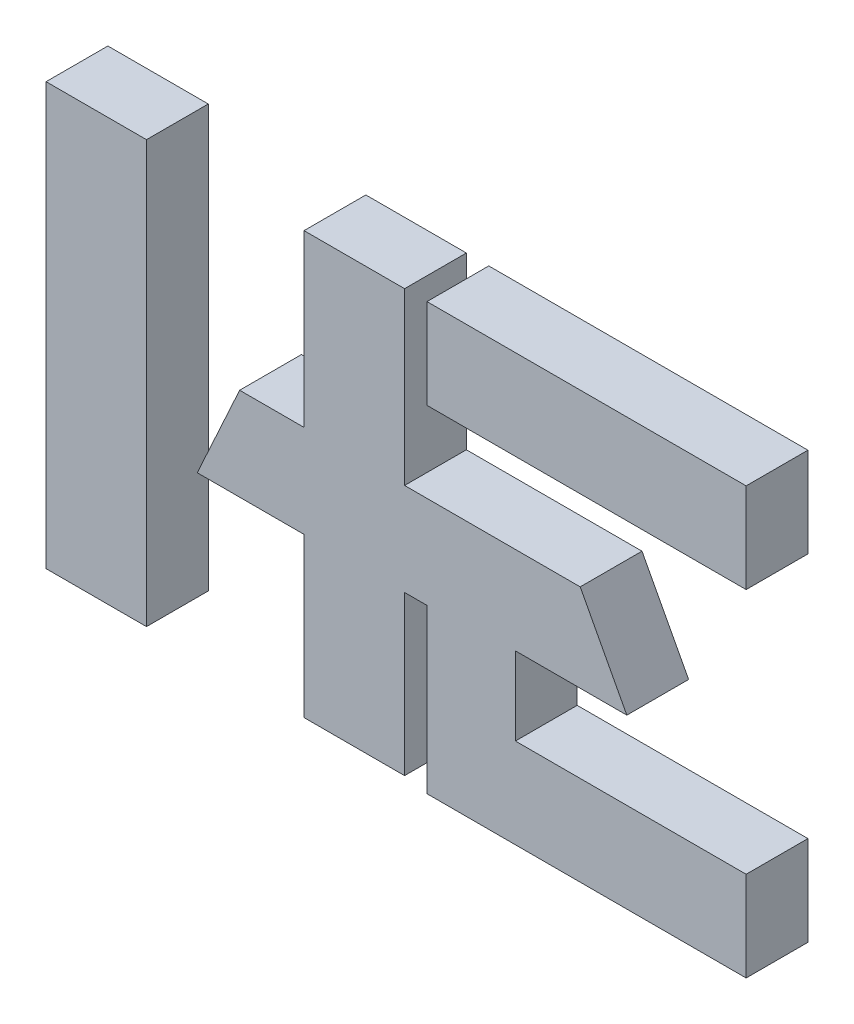
ISO-10303-21;
HEADER;
FILE_DESCRIPTION(('STEP AP214'),'2;1');
FILE_NAME('part.step','',(''),(''),'','','');
FILE_SCHEMA(('AUTOMOTIVE_DESIGN { 1 0 10303 214 1 1 1 1 }'));
ENDSEC;
DATA;
#1=APPLICATION_CONTEXT('core data for automotive mechanical design processes');
#2=APPLICATION_PROTOCOL_DEFINITION('international standard','automotive_design',2000,#1);
#3=PRODUCT_CONTEXT('',#1,'mechanical');
#4=PRODUCT('Part','Part','',(#3));
#5=PRODUCT_RELATED_PRODUCT_CATEGORY('part','',(#4));
#6=PRODUCT_DEFINITION_FORMATION('','',#4);
#7=PRODUCT_DEFINITION_CONTEXT('part definition',#1,'design');
#8=PRODUCT_DEFINITION('design','',#6,#7);
#9=PRODUCT_DEFINITION_SHAPE('','',#8);
#10=(LENGTH_UNIT() NAMED_UNIT(*) SI_UNIT(.MILLI.,.METRE.));
#11=(NAMED_UNIT(*) PLANE_ANGLE_UNIT() SI_UNIT($,.RADIAN.));
#12=(NAMED_UNIT(*) SI_UNIT($,.STERADIAN.) SOLID_ANGLE_UNIT());
#13=UNCERTAINTY_MEASURE_WITH_UNIT(LENGTH_MEASURE(1.E-05),#10,'distance_accuracy_value','');
#14=(GEOMETRIC_REPRESENTATION_CONTEXT(3) GLOBAL_UNCERTAINTY_ASSIGNED_CONTEXT((#13)) GLOBAL_UNIT_ASSIGNED_CONTEXT((#10,
#11,#12)) REPRESENTATION_CONTEXT('',''));
#15=CARTESIAN_POINT('',(0.,0.,0.));
#16=DIRECTION('',(0.,0.,1.));
#17=DIRECTION('',(1.,0.,0.));
#18=AXIS2_PLACEMENT_3D('',#15,#16,#17);
#19=CARTESIAN_POINT('',(11.3288772320232,6.86112874345373,2.6));
#20=DIRECTION('',(-1.,0.,0.));
#21=DIRECTION('',(0.,-1.,0.));
#22=AXIS2_PLACEMENT_3D('',#19,#20,#21);
#23=PLANE('',#22);
#24=DIRECTION('',(0.,1.,0.));
#25=VECTOR('',#24,1.);
#26=CARTESIAN_POINT('',(11.3288772320232,6.86112874345373,2.));
#27=LINE('',#26,#25);
#28=CARTESIAN_POINT('',(11.3288772320232,3.95299492930097,2.));
#29=VERTEX_POINT('',#28);
#30=CARTESIAN_POINT('',(11.3288772320232,6.86112874345373,2.));
#31=VERTEX_POINT('',#30);
#32=EDGE_CURVE('E84',#29,#31,#27,.T.);
#33=ORIENTED_EDGE('',*,*,#32,.F.);
#34=DIRECTION('',(0.,0.,-1.));
#35=VECTOR('',#34,1.);
#36=CARTESIAN_POINT('',(11.3288772320232,3.95299492930097,2.6));
#37=LINE('',#36,#35);
#38=CARTESIAN_POINT('',(11.3288772320232,3.95299492930097,0.));
#39=VERTEX_POINT('',#38);
#40=EDGE_CURVE('E66',#29,#39,#37,.T.);
#41=ORIENTED_EDGE('',*,*,#40,.T.);
#42=DIRECTION('',(0.,1.,0.));
#43=VECTOR('',#42,1.);
#44=CARTESIAN_POINT('',(11.3288772320232,6.86112874345373,0.));
#45=LINE('',#44,#43);
#46=CARTESIAN_POINT('',(11.3288772320232,6.86112874345373,0.));
#47=VERTEX_POINT('',#46);
#48=EDGE_CURVE('E89',#39,#47,#45,.T.);
#49=ORIENTED_EDGE('',*,*,#48,.T.);
#50=DIRECTION('',(0.,0.,-1.));
#51=VECTOR('',#50,1.);
#52=CARTESIAN_POINT('',(11.3288772320232,6.86112874345373,2.6));
#53=LINE('',#52,#51);
#54=EDGE_CURVE('E52',#31,#47,#53,.T.);
#55=ORIENTED_EDGE('',*,*,#54,.F.);
#56=EDGE_LOOP('',(#33,#41,#49,#55));
#57=FACE_BOUND('',#56,.T.);
#58=ADVANCED_FACE('F45',(#57),#23,.F.);
#59=CARTESIAN_POINT('',(11.3288772320232,6.86112874345373,2.6));
#60=DIRECTION('',(0.,-1.,0.));
#61=DIRECTION('',(1.,0.,0.));
#62=AXIS2_PLACEMENT_3D('',#59,#60,#61);
#63=PLANE('',#62);
#64=DIRECTION('',(-1.,0.,0.));
#65=VECTOR('',#64,1.);
#66=CARTESIAN_POINT('',(11.3288772320232,6.86112874345373,2.));
#67=LINE('',#66,#65);
#68=CARTESIAN_POINT('',(0.999606814590283,6.86112874345373,2.));
#69=VERTEX_POINT('',#68);
#70=EDGE_CURVE('E90',#31,#69,#67,.T.);
#71=ORIENTED_EDGE('',*,*,#70,.F.);
#72=ORIENTED_EDGE('',*,*,#54,.T.);
#73=DIRECTION('',(-1.,0.,0.));
#74=VECTOR('',#73,1.);
#75=CARTESIAN_POINT('',(11.3288772320232,6.86112874345373,0.));
#76=LINE('',#75,#74);
#77=CARTESIAN_POINT('',(0.999606814590283,6.86112874345373,0.));
#78=VERTEX_POINT('',#77);
#79=EDGE_CURVE('E109',#47,#78,#76,.T.);
#80=ORIENTED_EDGE('',*,*,#79,.T.);
#81=DIRECTION('',(0.,0.,-1.));
#82=VECTOR('',#81,1.);
#83=CARTESIAN_POINT('',(0.999606814590283,6.86112874345373,2.6));
#84=LINE('',#83,#82);
#85=EDGE_CURVE('E98',#69,#78,#84,.T.);
#86=ORIENTED_EDGE('',*,*,#85,.F.);
#87=EDGE_LOOP('',(#71,#72,#80,#86));
#88=FACE_BOUND('',#87,.T.);
#89=ADVANCED_FACE('F107',(#88),#63,.F.);
#90=CARTESIAN_POINT('',(0.999606814590283,6.86112874345373,2.6));
#91=DIRECTION('',(1.,0.,0.));
#92=DIRECTION('',(0.,1.,0.));
#93=AXIS2_PLACEMENT_3D('',#90,#91,#92);
#94=PLANE('',#93);
#95=DIRECTION('',(0.,-1.,0.));
#96=VECTOR('',#95,1.);
#97=CARTESIAN_POINT('',(0.999606814590283,6.86112874345373,2.));
#98=LINE('',#97,#96);
#99=CARTESIAN_POINT('',(0.999606814590285,3.95299492930097,2.));
#100=VERTEX_POINT('',#99);
#101=EDGE_CURVE('E58',#69,#100,#98,.T.);
#102=ORIENTED_EDGE('',*,*,#101,.F.);
#103=ORIENTED_EDGE('',*,*,#85,.T.);
#104=DIRECTION('',(0.,-1.,0.));
#105=VECTOR('',#104,1.);
#106=CARTESIAN_POINT('',(0.999606814590283,6.86112874345373,0.));
#107=LINE('',#106,#105);
#108=CARTESIAN_POINT('',(0.999606814590285,3.95299492930097,0.));
#109=VERTEX_POINT('',#108);
#110=EDGE_CURVE('E100',#78,#109,#107,.T.);
#111=ORIENTED_EDGE('',*,*,#110,.T.);
#112=DIRECTION('',(0.,0.,-1.));
#113=VECTOR('',#112,1.);
#114=CARTESIAN_POINT('',(0.999606814590285,3.95299492930097,2.6));
#115=LINE('',#114,#113);
#116=EDGE_CURVE('E96',#100,#109,#115,.T.);
#117=ORIENTED_EDGE('',*,*,#116,.F.);
#118=EDGE_LOOP('',(#102,#103,#111,#117));
#119=FACE_BOUND('',#118,.T.);
#120=ADVANCED_FACE('F118',(#119),#94,.F.);
#121=CARTESIAN_POINT('',(11.3288772320232,3.95299492930097,2.6));
#122=DIRECTION('',(0.,1.,0.));
#123=DIRECTION('',(-1.,0.,0.));
#124=AXIS2_PLACEMENT_3D('',#121,#122,#123);
#125=PLANE('',#124);
#126=DIRECTION('',(1.,0.,0.));
#127=VECTOR('',#126,1.);
#128=CARTESIAN_POINT('',(11.3288772320232,3.95299492930097,2.));
#129=LINE('',#128,#127);
#130=EDGE_CURVE('E12',#100,#29,#129,.T.);
#131=ORIENTED_EDGE('',*,*,#130,.F.);
#132=ORIENTED_EDGE('',*,*,#116,.T.);
#133=DIRECTION('',(1.,0.,0.));
#134=VECTOR('',#133,1.);
#135=CARTESIAN_POINT('',(11.3288772320232,3.95299492930097,0.));
#136=LINE('',#135,#134);
#137=EDGE_CURVE('E94',#109,#39,#136,.T.);
#138=ORIENTED_EDGE('',*,*,#137,.T.);
#139=ORIENTED_EDGE('',*,*,#40,.F.);
#140=EDGE_LOOP('',(#131,#132,#138,#139));
#141=FACE_BOUND('',#140,.T.);
#142=ADVANCED_FACE('F92',(#141),#125,.F.);
#143=CARTESIAN_POINT('',(0.,0.,0.));
#144=DIRECTION('',(0.,0.,-1.));
#145=DIRECTION('',(-1.,0.,0.));
#146=AXIS2_PLACEMENT_3D('',#143,#144,#145);
#147=PLANE('',#146);
#148=ORIENTED_EDGE('',*,*,#48,.F.);
#149=ORIENTED_EDGE('',*,*,#137,.F.);
#150=ORIENTED_EDGE('',*,*,#110,.F.);
#151=ORIENTED_EDGE('',*,*,#79,.F.);
#152=EDGE_LOOP('',(#148,#149,#150,#151));
#153=FACE_BOUND('',#152,.T.);
#154=ADVANCED_FACE('F112',(#153),#147,.T.);
#155=CARTESIAN_POINT('',(0.,0.,2.));
#156=DIRECTION('',(0.,0.,1.));
#157=DIRECTION('',(1.,0.,0.));
#158=AXIS2_PLACEMENT_3D('',#155,#156,#157);
#159=PLANE('',#158);
#160=ORIENTED_EDGE('',*,*,#32,.T.);
#161=ORIENTED_EDGE('',*,*,#70,.T.);
#162=ORIENTED_EDGE('',*,*,#101,.T.);
#163=ORIENTED_EDGE('',*,*,#130,.T.);
#164=EDGE_LOOP('',(#160,#161,#162,#163));
#165=FACE_BOUND('',#164,.T.);
#166=ADVANCED_FACE('F83',(#165),#159,.T.);
#167=CLOSED_SHELL('',(#58,#89,#120,#142,#154,#166));
#168=MANIFOLD_SOLID_BREP('B2',#167);
#169=CARTESIAN_POINT('',(11.3288772320232,-4.02525241620843,2.6));
#170=DIRECTION('',(-1.,0.,0.));
#171=DIRECTION('',(0.,-1.,0.));
#172=AXIS2_PLACEMENT_3D('',#169,#170,#171);
#173=PLANE('',#172);
#174=DIRECTION('',(0.,1.,0.));
#175=VECTOR('',#174,1.);
#176=CARTESIAN_POINT('',(11.3288772320232,-4.02525241620843,2.));
#177=LINE('',#176,#175);
#178=CARTESIAN_POINT('',(11.3288772320232,-6.93338623036118,2.));
#179=VERTEX_POINT('',#178);
#180=CARTESIAN_POINT('',(11.3288772320232,-4.02525241620843,2.));
#181=VERTEX_POINT('',#180);
#182=EDGE_CURVE('E300',#179,#181,#177,.T.);
#183=ORIENTED_EDGE('',*,*,#182,.F.);
#184=DIRECTION('',(0.,0.,-1.));
#185=VECTOR('',#184,1.);
#186=CARTESIAN_POINT('',(11.3288772320232,-6.93338623036118,2.6));
#187=LINE('',#186,#185);
#188=CARTESIAN_POINT('',(11.3288772320232,-6.93338623036118,0.));
#189=VERTEX_POINT('',#188);
#190=EDGE_CURVE('E198',#179,#189,#187,.T.);
#191=ORIENTED_EDGE('',*,*,#190,.T.);
#192=DIRECTION('',(0.,1.,0.));
#193=VECTOR('',#192,1.);
#194=CARTESIAN_POINT('',(11.3288772320232,-4.02525241620843,0.));
#195=LINE('',#194,#193);
#196=CARTESIAN_POINT('',(11.3288772320232,-4.02525241620843,0.));
#197=VERTEX_POINT('',#196);
#198=EDGE_CURVE('E305',#189,#197,#195,.T.);
#199=ORIENTED_EDGE('',*,*,#198,.T.);
#200=DIRECTION('',(0.,0.,-1.));
#201=VECTOR('',#200,1.);
#202=CARTESIAN_POINT('',(11.3288772320232,-4.02525241620843,2.6));
#203=LINE('',#202,#201);
#204=EDGE_CURVE('E184',#181,#197,#203,.T.);
#205=ORIENTED_EDGE('',*,*,#204,.F.);
#206=EDGE_LOOP('',(#183,#191,#199,#205));
#207=FACE_BOUND('',#206,.T.);
#208=ADVANCED_FACE('F177',(#207),#173,.F.);
#209=CARTESIAN_POINT('',(11.3288772320232,-4.02525241620843,2.6));
#210=DIRECTION('',(0.,-1.,0.));
#211=DIRECTION('',(1.,0.,0.));
#212=AXIS2_PLACEMENT_3D('',#209,#210,#211);
#213=PLANE('',#212);
#214=DIRECTION('',(-1.,0.,0.));
#215=VECTOR('',#214,1.);
#216=CARTESIAN_POINT('',(11.3288772320232,-4.02525241620843,2.));
#217=LINE('',#216,#215);
#218=CARTESIAN_POINT('',(3.86122632302522,-4.02525241620843,2.));
#219=VERTEX_POINT('',#218);
#220=EDGE_CURVE('E306',#181,#219,#217,.T.);
#221=ORIENTED_EDGE('',*,*,#220,.F.);
#222=ORIENTED_EDGE('',*,*,#204,.T.);
#223=DIRECTION('',(-1.,0.,0.));
#224=VECTOR('',#223,1.);
#225=CARTESIAN_POINT('',(11.3288772320232,-4.02525241620843,0.));
#226=LINE('',#225,#224);
#227=CARTESIAN_POINT('',(3.86122632302522,-4.02525241620843,0.));
#228=VERTEX_POINT('',#227);
#229=EDGE_CURVE('E353',#197,#228,#226,.T.);
#230=ORIENTED_EDGE('',*,*,#229,.T.);
#231=DIRECTION('',(0.,0.,-1.));
#232=VECTOR('',#231,1.);
#233=CARTESIAN_POINT('',(3.86122632302522,-4.02525241620843,2.6));
#234=LINE('',#233,#232);
#235=EDGE_CURVE('E347',#219,#228,#234,.T.);
#236=ORIENTED_EDGE('',*,*,#235,.F.);
#237=EDGE_LOOP('',(#221,#222,#230,#236));
#238=FACE_BOUND('',#237,.T.);
#239=ADVANCED_FACE('F351',(#238),#213,.F.);
#240=CARTESIAN_POINT('',(3.86122632302522,-4.02525241620843,2.6));
#241=DIRECTION('',(-1.,0.,0.));
#242=DIRECTION('',(0.,0.,1.));
#243=AXIS2_PLACEMENT_3D('',#240,#241,#242);
#244=PLANE('',#243);
#245=DIRECTION('',(0.,1.,0.));
#246=VECTOR('',#245,1.);
#247=CARTESIAN_POINT('',(3.86122632302522,-4.02525241620843,2.));
#248=LINE('',#247,#246);
#249=CARTESIAN_POINT('',(3.86122632302522,-1.49683517930358,2.));
#250=VERTEX_POINT('',#249);
#251=EDGE_CURVE('E483',#219,#250,#248,.T.);
#252=ORIENTED_EDGE('',*,*,#251,.F.);
#253=ORIENTED_EDGE('',*,*,#235,.T.);
#254=DIRECTION('',(0.,1.,0.));
#255=VECTOR('',#254,1.);
#256=CARTESIAN_POINT('',(3.86122632302522,-4.02525241620843,0.));
#257=LINE('',#256,#255);
#258=CARTESIAN_POINT('',(3.86122632302522,-1.49683517930358,0.));
#259=VERTEX_POINT('',#258);
#260=EDGE_CURVE('E359',#228,#259,#257,.T.);
#261=ORIENTED_EDGE('',*,*,#260,.T.);
#262=DIRECTION('',(0.,0.,-1.));
#263=VECTOR('',#262,1.);
#264=CARTESIAN_POINT('',(3.86122632302522,-1.49683517930358,2.6));
#265=LINE('',#264,#263);
#266=EDGE_CURVE('E345',#250,#259,#265,.T.);
#267=ORIENTED_EDGE('',*,*,#266,.F.);
#268=EDGE_LOOP('',(#252,#253,#261,#267));
#269=FACE_BOUND('',#268,.T.);
#270=ADVANCED_FACE('F482',(#269),#244,.F.);
#271=CARTESIAN_POINT('',(5.95844062030288,-1.49683517930358,2.6));
#272=DIRECTION('',(0.,1.,0.));
#273=DIRECTION('',(0.,0.,1.));
#274=AXIS2_PLACEMENT_3D('',#271,#272,#273);
#275=PLANE('',#274);
#276=DIRECTION('',(1.,0.,0.));
#277=VECTOR('',#276,1.);
#278=CARTESIAN_POINT('',(5.95844062030288,-1.49683517930358,2.));
#279=LINE('',#278,#277);
#280=CARTESIAN_POINT('',(7.46765090899802,-1.49683517930358,2.));
#281=VERTEX_POINT('',#280);
#282=EDGE_CURVE('E485',#250,#281,#279,.T.);
#283=ORIENTED_EDGE('',*,*,#282,.F.);
#284=ORIENTED_EDGE('',*,*,#266,.T.);
#285=DIRECTION('',(1.,0.,0.));
#286=VECTOR('',#285,1.);
#287=CARTESIAN_POINT('',(5.95844062030288,-1.49683517930358,0.));
#288=LINE('',#287,#286);
#289=CARTESIAN_POINT('',(7.46765090899802,-1.49683517930358,0.));
#290=VERTEX_POINT('',#289);
#291=EDGE_CURVE('E365',#259,#290,#288,.T.);
#292=ORIENTED_EDGE('',*,*,#291,.T.);
#293=DIRECTION('',(0.,0.,-1.));
#294=VECTOR('',#293,1.);
#295=CARTESIAN_POINT('',(7.46765090899802,-1.49683517930358,2.6));
#296=LINE('',#295,#294);
#297=EDGE_CURVE('E343',#281,#290,#296,.T.);
#298=ORIENTED_EDGE('',*,*,#297,.F.);
#299=EDGE_LOOP('',(#283,#284,#292,#298));
#300=FACE_BOUND('',#299,.T.);
#301=ADVANCED_FACE('F503',(#300),#275,.F.);
#302=CARTESIAN_POINT('',(7.46765090899802,-1.49683517930358,2.6));
#303=DIRECTION('',(-0.883194569851671,-0.469006771576406,0.));
#304=DIRECTION('',(0.469006771576406,-0.883194569851671,0.));
#305=AXIS2_PLACEMENT_3D('',#302,#303,#304);
#306=PLANE('',#305);
#307=DIRECTION('',(-0.469006771576406,0.883194569851671,0.));
#308=VECTOR('',#307,1.);
#309=CARTESIAN_POINT('',(7.46765090899802,-1.49683517930358,2.));
#310=LINE('',#309,#308);
#311=CARTESIAN_POINT('',(5.95844062030288,1.34518419551193,2.));
#312=VERTEX_POINT('',#311);
#313=EDGE_CURVE('E476',#281,#312,#310,.T.);
#314=ORIENTED_EDGE('',*,*,#313,.F.);
#315=ORIENTED_EDGE('',*,*,#297,.T.);
#316=DIRECTION('',(-0.469006771576406,0.883194569851671,0.));
#317=VECTOR('',#316,1.);
#318=CARTESIAN_POINT('',(7.46765090899802,-1.49683517930358,0.));
#319=LINE('',#318,#317);
#320=CARTESIAN_POINT('',(5.95844062030288,1.34518419551193,0.));
#321=VERTEX_POINT('',#320);
#322=EDGE_CURVE('E368',#290,#321,#319,.T.);
#323=ORIENTED_EDGE('',*,*,#322,.T.);
#324=DIRECTION('',(0.,0.,-1.));
#325=VECTOR('',#324,1.);
#326=CARTESIAN_POINT('',(5.95844062030288,1.34518419551193,2.6));
#327=LINE('',#326,#325);
#328=EDGE_CURVE('E341',#312,#321,#327,.T.);
#329=ORIENTED_EDGE('',*,*,#328,.F.);
#330=EDGE_LOOP('',(#314,#315,#323,#329));
#331=FACE_BOUND('',#330,.T.);
#332=ADVANCED_FACE('F475',(#331),#306,.F.);
#333=CARTESIAN_POINT('',(0.999606814590284,1.34518419551193,2.6));
#334=DIRECTION('',(0.,-1.,0.));
#335=DIRECTION('',(0.,0.,-1.));
#336=AXIS2_PLACEMENT_3D('',#333,#334,#335);
#337=PLANE('',#336);
#338=DIRECTION('',(-1.,0.,0.));
#339=VECTOR('',#338,1.);
#340=CARTESIAN_POINT('',(0.999606814590284,1.34518419551193,2.));
#341=LINE('',#340,#339);
#342=CARTESIAN_POINT('',(0.274401870671843,1.34518419551193,2.));
#343=VERTEX_POINT('',#342);
#344=EDGE_CURVE('E472',#312,#343,#341,.T.);
#345=ORIENTED_EDGE('',*,*,#344,.F.);
#346=ORIENTED_EDGE('',*,*,#328,.T.);
#347=DIRECTION('',(-1.,0.,0.));
#348=VECTOR('',#347,1.);
#349=CARTESIAN_POINT('',(0.999606814590284,1.34518419551193,0.));
#350=LINE('',#349,#348);
#351=CARTESIAN_POINT('',(0.274401870671843,1.34518419551193,0.));
#352=VERTEX_POINT('',#351);
#353=EDGE_CURVE('E371',#321,#352,#350,.T.);
#354=ORIENTED_EDGE('',*,*,#353,.T.);
#355=DIRECTION('',(0.,0.,-1.));
#356=VECTOR('',#355,1.);
#357=CARTESIAN_POINT('',(0.274401870671843,1.34518419551193,2.6));
#358=LINE('',#357,#356);
#359=EDGE_CURVE('E339',#343,#352,#358,.T.);
#360=ORIENTED_EDGE('',*,*,#359,.F.);
#361=EDGE_LOOP('',(#345,#346,#354,#360));
#362=FACE_BOUND('',#361,.T.);
#363=ADVANCED_FACE('F470',(#362),#337,.F.);
#364=CARTESIAN_POINT('',(0.274401870671842,6.86112874345373,2.6));
#365=DIRECTION('',(-1.,0.,0.));
#366=DIRECTION('',(0.,-1.,0.));
#367=AXIS2_PLACEMENT_3D('',#364,#365,#366);
#368=PLANE('',#367);
#369=DIRECTION('',(0.,1.,0.));
#370=VECTOR('',#369,1.);
#371=CARTESIAN_POINT('',(0.274401870671842,6.86112874345373,2.));
#372=LINE('',#371,#370);
#373=CARTESIAN_POINT('',(0.274401870671842,6.86112874345373,2.));
#374=VERTEX_POINT('',#373);
#375=EDGE_CURVE('E467',#343,#374,#372,.T.);
#376=ORIENTED_EDGE('',*,*,#375,.F.);
#377=ORIENTED_EDGE('',*,*,#359,.T.);
#378=DIRECTION('',(0.,1.,0.));
#379=VECTOR('',#378,1.);
#380=CARTESIAN_POINT('',(0.274401870671842,6.86112874345373,0.));
#381=LINE('',#380,#379);
#382=CARTESIAN_POINT('',(0.274401870671842,6.86112874345373,0.));
#383=VERTEX_POINT('',#382);
#384=EDGE_CURVE('E374',#352,#383,#381,.T.);
#385=ORIENTED_EDGE('',*,*,#384,.T.);
#386=DIRECTION('',(0.,0.,-1.));
#387=VECTOR('',#386,1.);
#388=CARTESIAN_POINT('',(0.274401870671842,6.86112874345373,2.6));
#389=LINE('',#388,#387);
#390=EDGE_CURVE('E337',#374,#383,#389,.T.);
#391=ORIENTED_EDGE('',*,*,#390,.F.);
#392=EDGE_LOOP('',(#376,#377,#385,#391));
#393=FACE_BOUND('',#392,.T.);
#394=ADVANCED_FACE('F465',(#393),#368,.F.);
#395=CARTESIAN_POINT('',(0.274401870671842,6.86112874345373,2.6));
#396=DIRECTION('',(0.,-1.,0.));
#397=DIRECTION('',(0.,0.,-1.));
#398=AXIS2_PLACEMENT_3D('',#395,#396,#397);
#399=PLANE('',#398);
#400=DIRECTION('',(-1.,0.,0.));
#401=VECTOR('',#400,1.);
#402=CARTESIAN_POINT('',(0.274401870671842,6.86112874345373,2.));
#403=LINE('',#402,#401);
#404=CARTESIAN_POINT('',(-2.97922031015144,6.86112874345373,2.));
#405=VERTEX_POINT('',#404);
#406=EDGE_CURVE('E492',#374,#405,#403,.T.);
#407=ORIENTED_EDGE('',*,*,#406,.F.);
#408=ORIENTED_EDGE('',*,*,#390,.T.);
#409=DIRECTION('',(-1.,0.,0.));
#410=VECTOR('',#409,1.);
#411=CARTESIAN_POINT('',(0.274401870671842,6.86112874345373,0.));
#412=LINE('',#411,#410);
#413=CARTESIAN_POINT('',(-2.97922031015144,6.86112874345373,0.));
#414=VERTEX_POINT('',#413);
#415=EDGE_CURVE('E377',#383,#414,#412,.T.);
#416=ORIENTED_EDGE('',*,*,#415,.T.);
#417=DIRECTION('',(0.,0.,-1.));
#418=VECTOR('',#417,1.);
#419=CARTESIAN_POINT('',(-2.97922031015144,6.86112874345373,2.6));
#420=LINE('',#419,#418);
#421=EDGE_CURVE('E335',#405,#414,#420,.T.);
#422=ORIENTED_EDGE('',*,*,#421,.F.);
#423=EDGE_LOOP('',(#407,#408,#416,#422));
#424=FACE_BOUND('',#423,.T.);
#425=ADVANCED_FACE('F458',(#424),#399,.F.);
#426=CARTESIAN_POINT('',(-2.97922031015144,6.86112874345373,2.6));
#427=DIRECTION('',(1.,0.,0.));
#428=DIRECTION('',(0.,1.,0.));
#429=AXIS2_PLACEMENT_3D('',#426,#427,#428);
#430=PLANE('',#429);
#431=DIRECTION('',(0.,-1.,0.));
#432=VECTOR('',#431,1.);
#433=CARTESIAN_POINT('',(-2.97922031015144,6.86112874345373,2.));
#434=LINE('',#433,#432);
#435=CARTESIAN_POINT('',(-2.97922031015144,1.34518419551193,2.));
#436=VERTEX_POINT('',#435);
#437=EDGE_CURVE('E455',#405,#436,#434,.T.);
#438=ORIENTED_EDGE('',*,*,#437,.F.);
#439=ORIENTED_EDGE('',*,*,#421,.T.);
#440=DIRECTION('',(0.,-1.,0.));
#441=VECTOR('',#440,1.);
#442=CARTESIAN_POINT('',(-2.97922031015144,6.86112874345373,0.));
#443=LINE('',#442,#441);
#444=CARTESIAN_POINT('',(-2.97922031015144,1.34518419551193,0.));
#445=VERTEX_POINT('',#444);
#446=EDGE_CURVE('E380',#414,#445,#443,.T.);
#447=ORIENTED_EDGE('',*,*,#446,.T.);
#448=DIRECTION('',(0.,0.,-1.));
#449=VECTOR('',#448,1.);
#450=CARTESIAN_POINT('',(-2.97922031015144,1.34518419551193,2.6));
#451=LINE('',#450,#449);
#452=EDGE_CURVE('E333',#436,#445,#451,.T.);
#453=ORIENTED_EDGE('',*,*,#452,.F.);
#454=EDGE_LOOP('',(#438,#439,#447,#453));
#455=FACE_BOUND('',#454,.T.);
#456=ADVANCED_FACE('F453',(#455),#430,.F.);
#457=CARTESIAN_POINT('',(-2.97922031015144,1.34518419551193,2.6));
#458=DIRECTION('',(0.,-1.,0.));
#459=DIRECTION('',(1.,0.,0.));
#460=AXIS2_PLACEMENT_3D('',#457,#458,#459);
#461=PLANE('',#460);
#462=DIRECTION('',(-1.,0.,0.));
#463=VECTOR('',#462,1.);
#464=CARTESIAN_POINT('',(-2.97922031015144,1.34518419551193,2.));
#465=LINE('',#464,#463);
#466=CARTESIAN_POINT('',(-5.06367607035237,1.34518419551193,2.));
#467=VERTEX_POINT('',#466);
#468=EDGE_CURVE('E450',#436,#467,#465,.T.);
#469=ORIENTED_EDGE('',*,*,#468,.F.);
#470=ORIENTED_EDGE('',*,*,#452,.T.);
#471=DIRECTION('',(-1.,0.,0.));
#472=VECTOR('',#471,1.);
#473=CARTESIAN_POINT('',(-2.97922031015144,1.34518419551193,0.));
#474=LINE('',#473,#472);
#475=CARTESIAN_POINT('',(-5.06367607035237,1.34518419551193,0.));
#476=VERTEX_POINT('',#475);
#477=EDGE_CURVE('E383',#445,#476,#474,.T.);
#478=ORIENTED_EDGE('',*,*,#477,.T.);
#479=DIRECTION('',(0.,0.,-1.));
#480=VECTOR('',#479,1.);
#481=CARTESIAN_POINT('',(-5.06367607035237,1.34518419551193,2.6));
#482=LINE('',#481,#480);
#483=EDGE_CURVE('E331',#467,#476,#482,.T.);
#484=ORIENTED_EDGE('',*,*,#483,.F.);
#485=EDGE_LOOP('',(#469,#470,#478,#484));
#486=FACE_BOUND('',#485,.T.);
#487=ADVANCED_FACE('F448',(#486),#461,.F.);
#488=CARTESIAN_POINT('',(-5.06367607035237,1.34518419551193,2.6));
#489=DIRECTION('',(0.909346012203621,-0.416040659178128,0.));
#490=DIRECTION('',(0.416040659178128,0.909346012203622,0.));
#491=AXIS2_PLACEMENT_3D('',#488,#489,#490);
#492=PLANE('',#491);
#493=DIRECTION('',(-0.416040659178128,-0.909346012203622,0.));
#494=VECTOR('',#493,1.);
#495=CARTESIAN_POINT('',(-5.06367607035237,1.34518419551193,2.));
#496=LINE('',#495,#494);
#497=CARTESIAN_POINT('',(-6.43568542371159,-1.65363624825892,2.));
#498=VERTEX_POINT('',#497);
#499=EDGE_CURVE('E441',#467,#498,#496,.T.);
#500=ORIENTED_EDGE('',*,*,#499,.F.);
#501=ORIENTED_EDGE('',*,*,#483,.T.);
#502=DIRECTION('',(-0.416040659178128,-0.909346012203621,0.));
#503=VECTOR('',#502,1.);
#504=CARTESIAN_POINT('',(-5.06367607035237,1.34518419551193,0.));
#505=LINE('',#504,#503);
#506=CARTESIAN_POINT('',(-6.43568542371159,-1.65363624825893,0.));
#507=VERTEX_POINT('',#506);
#508=EDGE_CURVE('E386',#476,#507,#505,.T.);
#509=ORIENTED_EDGE('',*,*,#508,.T.);
#510=DIRECTION('',(0.,0.,-1.));
#511=VECTOR('',#510,1.);
#512=CARTESIAN_POINT('',(-6.43568542371159,-1.65363624825893,2.6));
#513=LINE('',#512,#511);
#514=EDGE_CURVE('E329',#498,#507,#513,.T.);
#515=ORIENTED_EDGE('',*,*,#514,.F.);
#516=EDGE_LOOP('',(#500,#501,#509,#515));
#517=FACE_BOUND('',#516,.T.);
#518=ADVANCED_FACE('F440',(#517),#492,.F.);
#519=CARTESIAN_POINT('',(-2.97922031015144,-1.65363624825893,2.6));
#520=DIRECTION('',(0.,1.,0.));
#521=DIRECTION('',(-1.,0.,0.));
#522=AXIS2_PLACEMENT_3D('',#519,#520,#521);
#523=PLANE('',#522);
#524=DIRECTION('',(1.,0.,0.));
#525=VECTOR('',#524,1.);
#526=CARTESIAN_POINT('',(-2.97922031015144,-1.65363624825893,2.));
#527=LINE('',#526,#525);
#528=CARTESIAN_POINT('',(-2.97922031015144,-1.65363624825893,2.));
#529=VERTEX_POINT('',#528);
#530=EDGE_CURVE('E437',#498,#529,#527,.T.);
#531=ORIENTED_EDGE('',*,*,#530,.F.);
#532=ORIENTED_EDGE('',*,*,#514,.T.);
#533=DIRECTION('',(1.,0.,0.));
#534=VECTOR('',#533,1.);
#535=CARTESIAN_POINT('',(-2.97922031015144,-1.65363624825893,0.));
#536=LINE('',#535,#534);
#537=CARTESIAN_POINT('',(-2.97922031015144,-1.65363624825893,0.));
#538=VERTEX_POINT('',#537);
#539=EDGE_CURVE('E389',#507,#538,#536,.T.);
#540=ORIENTED_EDGE('',*,*,#539,.T.);
#541=DIRECTION('',(0.,0.,-1.));
#542=VECTOR('',#541,1.);
#543=CARTESIAN_POINT('',(-2.97922031015144,-1.65363624825893,2.6));
#544=LINE('',#543,#542);
#545=EDGE_CURVE('E327',#529,#538,#544,.T.);
#546=ORIENTED_EDGE('',*,*,#545,.F.);
#547=EDGE_LOOP('',(#531,#532,#540,#546));
#548=FACE_BOUND('',#547,.T.);
#549=ADVANCED_FACE('F435',(#548),#523,.F.);
#550=CARTESIAN_POINT('',(-2.97922031015144,-1.65363624825893,2.6));
#551=DIRECTION('',(1.,0.,0.));
#552=DIRECTION('',(0.,1.,0.));
#553=AXIS2_PLACEMENT_3D('',#550,#551,#552);
#554=PLANE('',#553);
#555=DIRECTION('',(0.,-1.,0.));
#556=VECTOR('',#555,1.);
#557=CARTESIAN_POINT('',(-2.97922031015144,-1.65363624825893,2.));
#558=LINE('',#557,#556);
#559=CARTESIAN_POINT('',(-2.97922031015144,-6.78887125654627,2.));
#560=VERTEX_POINT('',#559);
#561=EDGE_CURVE('E432',#529,#560,#558,.T.);
#562=ORIENTED_EDGE('',*,*,#561,.F.);
#563=ORIENTED_EDGE('',*,*,#545,.T.);
#564=DIRECTION('',(0.,-1.,0.));
#565=VECTOR('',#564,1.);
#566=CARTESIAN_POINT('',(-2.97922031015144,-1.65363624825893,0.));
#567=LINE('',#566,#565);
#568=CARTESIAN_POINT('',(-2.97922031015144,-6.78887125654627,0.));
#569=VERTEX_POINT('',#568);
#570=EDGE_CURVE('E392',#538,#569,#567,.T.);
#571=ORIENTED_EDGE('',*,*,#570,.T.);
#572=DIRECTION('',(0.,0.,-1.));
#573=VECTOR('',#572,1.);
#574=CARTESIAN_POINT('',(-2.97922031015144,-6.78887125654627,2.6));
#575=LINE('',#574,#573);
#576=EDGE_CURVE('E325',#560,#569,#575,.T.);
#577=ORIENTED_EDGE('',*,*,#576,.F.);
#578=EDGE_LOOP('',(#562,#563,#571,#577));
#579=FACE_BOUND('',#578,.T.);
#580=ADVANCED_FACE('F430',(#579),#554,.F.);
#581=CARTESIAN_POINT('',(0.274401870671844,-6.78887125654627,2.6));
#582=DIRECTION('',(0.,1.,0.));
#583=DIRECTION('',(0.,0.,1.));
#584=AXIS2_PLACEMENT_3D('',#581,#582,#583);
#585=PLANE('',#584);
#586=DIRECTION('',(1.,0.,0.));
#587=VECTOR('',#586,1.);
#588=CARTESIAN_POINT('',(0.274401870671844,-6.78887125654627,2.));
#589=LINE('',#588,#587);
#590=CARTESIAN_POINT('',(0.274401870671844,-6.78887125654627,2.));
#591=VERTEX_POINT('',#590);
#592=EDGE_CURVE('E499',#560,#591,#589,.T.);
#593=ORIENTED_EDGE('',*,*,#592,.F.);
#594=ORIENTED_EDGE('',*,*,#576,.T.);
#595=DIRECTION('',(1.,0.,0.));
#596=VECTOR('',#595,1.);
#597=CARTESIAN_POINT('',(0.274401870671844,-6.78887125654627,0.));
#598=LINE('',#597,#596);
#599=CARTESIAN_POINT('',(0.274401870671844,-6.78887125654627,0.));
#600=VERTEX_POINT('',#599);
#601=EDGE_CURVE('E395',#569,#600,#598,.T.);
#602=ORIENTED_EDGE('',*,*,#601,.T.);
#603=DIRECTION('',(0.,0.,-1.));
#604=VECTOR('',#603,1.);
#605=CARTESIAN_POINT('',(0.274401870671844,-6.78887125654627,2.6));
#606=LINE('',#605,#604);
#607=EDGE_CURVE('E323',#591,#600,#606,.T.);
#608=ORIENTED_EDGE('',*,*,#607,.F.);
#609=EDGE_LOOP('',(#593,#594,#602,#608));
#610=FACE_BOUND('',#609,.T.);
#611=ADVANCED_FACE('F423',(#610),#585,.F.);
#612=CARTESIAN_POINT('',(0.274401870671843,-1.65363624825893,2.6));
#613=DIRECTION('',(-1.,0.,0.));
#614=DIRECTION('',(0.,-1.,0.));
#615=AXIS2_PLACEMENT_3D('',#612,#613,#614);
#616=PLANE('',#615);
#617=DIRECTION('',(0.,1.,0.));
#618=VECTOR('',#617,1.);
#619=CARTESIAN_POINT('',(0.274401870671843,-1.65363624825893,2.));
#620=LINE('',#619,#618);
#621=CARTESIAN_POINT('',(0.274401870671843,-1.65363624825893,2.));
#622=VERTEX_POINT('',#621);
#623=EDGE_CURVE('E420',#591,#622,#620,.T.);
#624=ORIENTED_EDGE('',*,*,#623,.F.);
#625=ORIENTED_EDGE('',*,*,#607,.T.);
#626=DIRECTION('',(0.,1.,0.));
#627=VECTOR('',#626,1.);
#628=CARTESIAN_POINT('',(0.274401870671843,-1.65363624825893,0.));
#629=LINE('',#628,#627);
#630=CARTESIAN_POINT('',(0.274401870671843,-1.65363624825893,0.));
#631=VERTEX_POINT('',#630);
#632=EDGE_CURVE('E398',#600,#631,#629,.T.);
#633=ORIENTED_EDGE('',*,*,#632,.T.);
#634=DIRECTION('',(0.,0.,-1.));
#635=VECTOR('',#634,1.);
#636=CARTESIAN_POINT('',(0.274401870671843,-1.65363624825893,2.6));
#637=LINE('',#636,#635);
#638=EDGE_CURVE('E321',#622,#631,#637,.T.);
#639=ORIENTED_EDGE('',*,*,#638,.F.);
#640=EDGE_LOOP('',(#624,#625,#633,#639));
#641=FACE_BOUND('',#640,.T.);
#642=ADVANCED_FACE('F418',(#641),#616,.F.);
#643=CARTESIAN_POINT('',(0.999606814590284,-1.65363624825893,2.6));
#644=DIRECTION('',(0.,1.,0.));
#645=DIRECTION('',(0.,0.,1.));
#646=AXIS2_PLACEMENT_3D('',#643,#644,#645);
#647=PLANE('',#646);
#648=DIRECTION('',(1.,0.,0.));
#649=VECTOR('',#648,1.);
#650=CARTESIAN_POINT('',(0.999606814590284,-1.65363624825893,2.));
#651=LINE('',#650,#649);
#652=CARTESIAN_POINT('',(0.999606814590284,-1.65363624825893,2.));
#653=VERTEX_POINT('',#652);
#654=EDGE_CURVE('E415',#622,#653,#651,.T.);
#655=ORIENTED_EDGE('',*,*,#654,.F.);
#656=ORIENTED_EDGE('',*,*,#638,.T.);
#657=DIRECTION('',(1.,0.,0.));
#658=VECTOR('',#657,1.);
#659=CARTESIAN_POINT('',(0.999606814590284,-1.65363624825893,0.));
#660=LINE('',#659,#658);
#661=CARTESIAN_POINT('',(0.999606814590284,-1.65363624825893,0.));
#662=VERTEX_POINT('',#661);
#663=EDGE_CURVE('E401',#631,#662,#660,.T.);
#664=ORIENTED_EDGE('',*,*,#663,.T.);
#665=DIRECTION('',(0.,0.,-1.));
#666=VECTOR('',#665,1.);
#667=CARTESIAN_POINT('',(0.999606814590284,-1.65363624825893,2.6));
#668=LINE('',#667,#666);
#669=EDGE_CURVE('E314',#653,#662,#668,.T.);
#670=ORIENTED_EDGE('',*,*,#669,.F.);
#671=EDGE_LOOP('',(#655,#656,#664,#670));
#672=FACE_BOUND('',#671,.T.);
#673=ADVANCED_FACE('F413',(#672),#647,.F.);
#674=CARTESIAN_POINT('',(0.999606814590284,-6.93338623036118,2.6));
#675=DIRECTION('',(1.,0.,0.));
#676=DIRECTION('',(0.,0.,-1.));
#677=AXIS2_PLACEMENT_3D('',#674,#675,#676);
#678=PLANE('',#677);
#679=DIRECTION('',(0.,-1.,0.));
#680=VECTOR('',#679,1.);
#681=CARTESIAN_POINT('',(0.999606814590284,-6.93338623036118,2.));
#682=LINE('',#681,#680);
#683=CARTESIAN_POINT('',(0.999606814590284,-6.93338623036118,2.));
#684=VERTEX_POINT('',#683);
#685=EDGE_CURVE('E190',#653,#684,#682,.T.);
#686=ORIENTED_EDGE('',*,*,#685,.F.);
#687=ORIENTED_EDGE('',*,*,#669,.T.);
#688=DIRECTION('',(0.,-1.,0.));
#689=VECTOR('',#688,1.);
#690=CARTESIAN_POINT('',(0.999606814590284,-6.93338623036118,0.));
#691=LINE('',#690,#689);
#692=CARTESIAN_POINT('',(0.999606814590284,-6.93338623036118,0.));
#693=VERTEX_POINT('',#692);
#694=EDGE_CURVE('E316',#662,#693,#691,.T.);
#695=ORIENTED_EDGE('',*,*,#694,.T.);
#696=DIRECTION('',(0.,0.,-1.));
#697=VECTOR('',#696,1.);
#698=CARTESIAN_POINT('',(0.999606814590284,-6.93338623036118,2.6));
#699=LINE('',#698,#697);
#700=EDGE_CURVE('E312',#684,#693,#699,.T.);
#701=ORIENTED_EDGE('',*,*,#700,.F.);
#702=EDGE_LOOP('',(#686,#687,#695,#701));
#703=FACE_BOUND('',#702,.T.);
#704=ADVANCED_FACE('F406',(#703),#678,.F.);
#705=CARTESIAN_POINT('',(11.3288772320232,-6.93338623036118,2.6));
#706=DIRECTION('',(0.,1.,0.));
#707=DIRECTION('',(0.,0.,1.));
#708=AXIS2_PLACEMENT_3D('',#705,#706,#707);
#709=PLANE('',#708);
#710=DIRECTION('',(1.,0.,0.));
#711=VECTOR('',#710,1.);
#712=CARTESIAN_POINT('',(11.3288772320232,-6.93338623036118,2.));
#713=LINE('',#712,#711);
#714=EDGE_CURVE('E43',#684,#179,#713,.T.);
#715=ORIENTED_EDGE('',*,*,#714,.F.);
#716=ORIENTED_EDGE('',*,*,#700,.T.);
#717=DIRECTION('',(1.,0.,0.));
#718=VECTOR('',#717,1.);
#719=CARTESIAN_POINT('',(11.3288772320232,-6.93338623036118,0.));
#720=LINE('',#719,#718);
#721=EDGE_CURVE('E310',#693,#189,#720,.T.);
#722=ORIENTED_EDGE('',*,*,#721,.T.);
#723=ORIENTED_EDGE('',*,*,#190,.F.);
#724=EDGE_LOOP('',(#715,#716,#722,#723));
#725=FACE_BOUND('',#724,.T.);
#726=ADVANCED_FACE('F308',(#725),#709,.F.);
#727=CARTESIAN_POINT('',(0.,0.,0.));
#728=DIRECTION('',(0.,0.,-1.));
#729=DIRECTION('',(-1.,0.,0.));
#730=AXIS2_PLACEMENT_3D('',#727,#728,#729);
#731=PLANE('',#730);
#732=ORIENTED_EDGE('',*,*,#198,.F.);
#733=ORIENTED_EDGE('',*,*,#721,.F.);
#734=ORIENTED_EDGE('',*,*,#694,.F.);
#735=ORIENTED_EDGE('',*,*,#663,.F.);
#736=ORIENTED_EDGE('',*,*,#632,.F.);
#737=ORIENTED_EDGE('',*,*,#601,.F.);
#738=ORIENTED_EDGE('',*,*,#570,.F.);
#739=ORIENTED_EDGE('',*,*,#539,.F.);
#740=ORIENTED_EDGE('',*,*,#508,.F.);
#741=ORIENTED_EDGE('',*,*,#477,.F.);
#742=ORIENTED_EDGE('',*,*,#446,.F.);
#743=ORIENTED_EDGE('',*,*,#415,.F.);
#744=ORIENTED_EDGE('',*,*,#384,.F.);
#745=ORIENTED_EDGE('',*,*,#353,.F.);
#746=ORIENTED_EDGE('',*,*,#322,.F.);
#747=ORIENTED_EDGE('',*,*,#291,.F.);
#748=ORIENTED_EDGE('',*,*,#260,.F.);
#749=ORIENTED_EDGE('',*,*,#229,.F.);
#750=EDGE_LOOP('',(#732,#733,#734,#735,#736,#737,#738,#739,#740,#741,#742,#743,#744,#745,#746,
#747,#748,#749));
#751=FACE_BOUND('',#750,.T.);
#752=ADVANCED_FACE('F356',(#751),#731,.T.);
#753=CARTESIAN_POINT('',(0.,0.,2.));
#754=DIRECTION('',(0.,0.,1.));
#755=DIRECTION('',(1.,0.,0.));
#756=AXIS2_PLACEMENT_3D('',#753,#754,#755);
#757=PLANE('',#756);
#758=ORIENTED_EDGE('',*,*,#182,.T.);
#759=ORIENTED_EDGE('',*,*,#220,.T.);
#760=ORIENTED_EDGE('',*,*,#251,.T.);
#761=ORIENTED_EDGE('',*,*,#282,.T.);
#762=ORIENTED_EDGE('',*,*,#313,.T.);
#763=ORIENTED_EDGE('',*,*,#344,.T.);
#764=ORIENTED_EDGE('',*,*,#375,.T.);
#765=ORIENTED_EDGE('',*,*,#406,.T.);
#766=ORIENTED_EDGE('',*,*,#437,.T.);
#767=ORIENTED_EDGE('',*,*,#468,.T.);
#768=ORIENTED_EDGE('',*,*,#499,.T.);
#769=ORIENTED_EDGE('',*,*,#530,.T.);
#770=ORIENTED_EDGE('',*,*,#561,.T.);
#771=ORIENTED_EDGE('',*,*,#592,.T.);
#772=ORIENTED_EDGE('',*,*,#623,.T.);
#773=ORIENTED_EDGE('',*,*,#654,.T.);
#774=ORIENTED_EDGE('',*,*,#685,.T.);
#775=ORIENTED_EDGE('',*,*,#714,.T.);
#776=EDGE_LOOP('',(#758,#759,#760,#761,#762,#763,#764,#765,#766,#767,#768,#769,#770,#771,#772,
#773,#774,#775));
#777=FACE_BOUND('',#776,.T.);
#778=ADVANCED_FACE('F299',(#777),#757,.T.);
#779=CLOSED_SHELL('',(#208,#239,#270,#301,#332,#363,#394,#425,#456,#487,#518,#549,#580,#611,
#642,#673,#704,#726,#752,#778));
#780=MANIFOLD_SOLID_BREP('B6',#779);
#781=CARTESIAN_POINT('',(-11.3288772320232,6.86112874345373,2.6));
#782=DIRECTION('',(1.,0.,0.));
#783=DIRECTION('',(0.,1.,0.));
#784=AXIS2_PLACEMENT_3D('',#781,#782,#783);
#785=PLANE('',#784);
#786=DIRECTION('',(0.,-1.,0.));
#787=VECTOR('',#786,1.);
#788=CARTESIAN_POINT('',(-11.3288772320232,6.86112874345373,2.));
#789=LINE('',#788,#787);
#790=CARTESIAN_POINT('',(-11.3288772320232,6.86112874345373,2.));
#791=VERTEX_POINT('',#790);
#792=CARTESIAN_POINT('',(-11.3288772320232,-6.78887125654627,2.));
#793=VERTEX_POINT('',#792);
#794=EDGE_CURVE('E764',#791,#793,#789,.T.);
#795=ORIENTED_EDGE('',*,*,#794,.F.);
#796=DIRECTION('',(0.,0.,-1.));
#797=VECTOR('',#796,1.);
#798=CARTESIAN_POINT('',(-11.3288772320232,6.86112874345373,2.6));
#799=LINE('',#798,#797);
#800=CARTESIAN_POINT('',(-11.3288772320232,6.86112874345373,0.));
#801=VERTEX_POINT('',#800);
#802=EDGE_CURVE('E746',#791,#801,#799,.T.);
#803=ORIENTED_EDGE('',*,*,#802,.T.);
#804=DIRECTION('',(0.,-1.,0.));
#805=VECTOR('',#804,1.);
#806=CARTESIAN_POINT('',(-11.3288772320232,6.86112874345373,0.));
#807=LINE('',#806,#805);
#808=CARTESIAN_POINT('',(-11.3288772320232,-6.78887125654627,0.));
#809=VERTEX_POINT('',#808);
#810=EDGE_CURVE('E769',#801,#809,#807,.T.);
#811=ORIENTED_EDGE('',*,*,#810,.T.);
#812=DIRECTION('',(0.,0.,-1.));
#813=VECTOR('',#812,1.);
#814=CARTESIAN_POINT('',(-11.3288772320232,-6.78887125654627,2.6));
#815=LINE('',#814,#813);
#816=EDGE_CURVE('E732',#793,#809,#815,.T.);
#817=ORIENTED_EDGE('',*,*,#816,.F.);
#818=EDGE_LOOP('',(#795,#803,#811,#817));
#819=FACE_BOUND('',#818,.T.);
#820=ADVANCED_FACE('F725',(#819),#785,.F.);
#821=CARTESIAN_POINT('',(-11.3288772320232,-6.78887125654627,2.6));
#822=DIRECTION('',(0.,1.,0.));
#823=DIRECTION('',(-1.,0.,0.));
#824=AXIS2_PLACEMENT_3D('',#821,#822,#823);
#825=PLANE('',#824);
#826=DIRECTION('',(1.,0.,0.));
#827=VECTOR('',#826,1.);
#828=CARTESIAN_POINT('',(-11.3288772320232,-6.78887125654627,2.));
#829=LINE('',#828,#827);
#830=CARTESIAN_POINT('',(-8.07887723202323,-6.78887125654627,2.));
#831=VERTEX_POINT('',#830);
#832=EDGE_CURVE('E770',#793,#831,#829,.T.);
#833=ORIENTED_EDGE('',*,*,#832,.F.);
#834=ORIENTED_EDGE('',*,*,#816,.T.);
#835=DIRECTION('',(1.,0.,0.));
#836=VECTOR('',#835,1.);
#837=CARTESIAN_POINT('',(-11.3288772320232,-6.78887125654627,0.));
#838=LINE('',#837,#836);
#839=CARTESIAN_POINT('',(-8.07887723202323,-6.78887125654627,0.));
#840=VERTEX_POINT('',#839);
#841=EDGE_CURVE('E789',#809,#840,#838,.T.);
#842=ORIENTED_EDGE('',*,*,#841,.T.);
#843=DIRECTION('',(0.,0.,-1.));
#844=VECTOR('',#843,1.);
#845=CARTESIAN_POINT('',(-8.07887723202323,-6.78887125654627,2.6));
#846=LINE('',#845,#844);
#847=EDGE_CURVE('E778',#831,#840,#846,.T.);
#848=ORIENTED_EDGE('',*,*,#847,.F.);
#849=EDGE_LOOP('',(#833,#834,#842,#848));
#850=FACE_BOUND('',#849,.T.);
#851=ADVANCED_FACE('F787',(#850),#825,.F.);
#852=CARTESIAN_POINT('',(-8.07887723202324,6.86112874345373,2.6));
#853=DIRECTION('',(-1.,0.,0.));
#854=DIRECTION('',(0.,-1.,0.));
#855=AXIS2_PLACEMENT_3D('',#852,#853,#854);
#856=PLANE('',#855);
#857=DIRECTION('',(0.,1.,0.));
#858=VECTOR('',#857,1.);
#859=CARTESIAN_POINT('',(-8.07887723202324,6.86112874345373,2.));
#860=LINE('',#859,#858);
#861=CARTESIAN_POINT('',(-8.07887723202324,6.86112874345373,2.));
#862=VERTEX_POINT('',#861);
#863=EDGE_CURVE('E738',#831,#862,#860,.T.);
#864=ORIENTED_EDGE('',*,*,#863,.F.);
#865=ORIENTED_EDGE('',*,*,#847,.T.);
#866=DIRECTION('',(0.,1.,0.));
#867=VECTOR('',#866,1.);
#868=CARTESIAN_POINT('',(-8.07887723202324,6.86112874345373,0.));
#869=LINE('',#868,#867);
#870=CARTESIAN_POINT('',(-8.07887723202324,6.86112874345373,0.));
#871=VERTEX_POINT('',#870);
#872=EDGE_CURVE('E780',#840,#871,#869,.T.);
#873=ORIENTED_EDGE('',*,*,#872,.T.);
#874=DIRECTION('',(0.,0.,-1.));
#875=VECTOR('',#874,1.);
#876=CARTESIAN_POINT('',(-8.07887723202324,6.86112874345373,2.6));
#877=LINE('',#876,#875);
#878=EDGE_CURVE('E776',#862,#871,#877,.T.);
#879=ORIENTED_EDGE('',*,*,#878,.F.);
#880=EDGE_LOOP('',(#864,#865,#873,#879));
#881=FACE_BOUND('',#880,.T.);
#882=ADVANCED_FACE('F798',(#881),#856,.F.);
#883=CARTESIAN_POINT('',(-11.3288772320232,6.86112874345373,2.6));
#884=DIRECTION('',(0.,-1.,0.));
#885=DIRECTION('',(0.,0.,-1.));
#886=AXIS2_PLACEMENT_3D('',#883,#884,#885);
#887=PLANE('',#886);
#888=DIRECTION('',(-1.,0.,0.));
#889=VECTOR('',#888,1.);
#890=CARTESIAN_POINT('',(-11.3288772320232,6.86112874345373,2.));
#891=LINE('',#890,#889);
#892=EDGE_CURVE('E175',#862,#791,#891,.T.);
#893=ORIENTED_EDGE('',*,*,#892,.F.);
#894=ORIENTED_EDGE('',*,*,#878,.T.);
#895=DIRECTION('',(-1.,0.,0.));
#896=VECTOR('',#895,1.);
#897=CARTESIAN_POINT('',(-11.3288772320232,6.86112874345373,0.));
#898=LINE('',#897,#896);
#899=EDGE_CURVE('E774',#871,#801,#898,.T.);
#900=ORIENTED_EDGE('',*,*,#899,.T.);
#901=ORIENTED_EDGE('',*,*,#802,.F.);
#902=EDGE_LOOP('',(#893,#894,#900,#901));
#903=FACE_BOUND('',#902,.T.);
#904=ADVANCED_FACE('F772',(#903),#887,.F.);
#905=CARTESIAN_POINT('',(0.,0.,0.));
#906=DIRECTION('',(0.,0.,1.));
#907=DIRECTION('',(1.,0.,0.));
#908=AXIS2_PLACEMENT_3D('',#905,#906,#907);
#909=PLANE('',#908);
#910=ORIENTED_EDGE('',*,*,#810,.F.);
#911=ORIENTED_EDGE('',*,*,#899,.F.);
#912=ORIENTED_EDGE('',*,*,#872,.F.);
#913=ORIENTED_EDGE('',*,*,#841,.F.);
#914=EDGE_LOOP('',(#910,#911,#912,#913));
#915=FACE_BOUND('',#914,.T.);
#916=ADVANCED_FACE('F792',(#915),#909,.F.);
#917=CARTESIAN_POINT('',(0.,0.,2.));
#918=DIRECTION('',(0.,0.,1.));
#919=DIRECTION('',(1.,0.,0.));
#920=AXIS2_PLACEMENT_3D('',#917,#918,#919);
#921=PLANE('',#920);
#922=ORIENTED_EDGE('',*,*,#794,.T.);
#923=ORIENTED_EDGE('',*,*,#832,.T.);
#924=ORIENTED_EDGE('',*,*,#863,.T.);
#925=ORIENTED_EDGE('',*,*,#892,.T.);
#926=EDGE_LOOP('',(#922,#923,#924,#925));
#927=FACE_BOUND('',#926,.T.);
#928=ADVANCED_FACE('F763',(#927),#921,.T.);
#929=CLOSED_SHELL('',(#820,#851,#882,#904,#916,#928));
#930=MANIFOLD_SOLID_BREP('B37',#929);
#931=ADVANCED_BREP_SHAPE_REPRESENTATION('',(#18,#168,#780,#930),#14);
#932=SHAPE_DEFINITION_REPRESENTATION(#9,#931);
ENDSEC;
END-ISO-10303-21;
